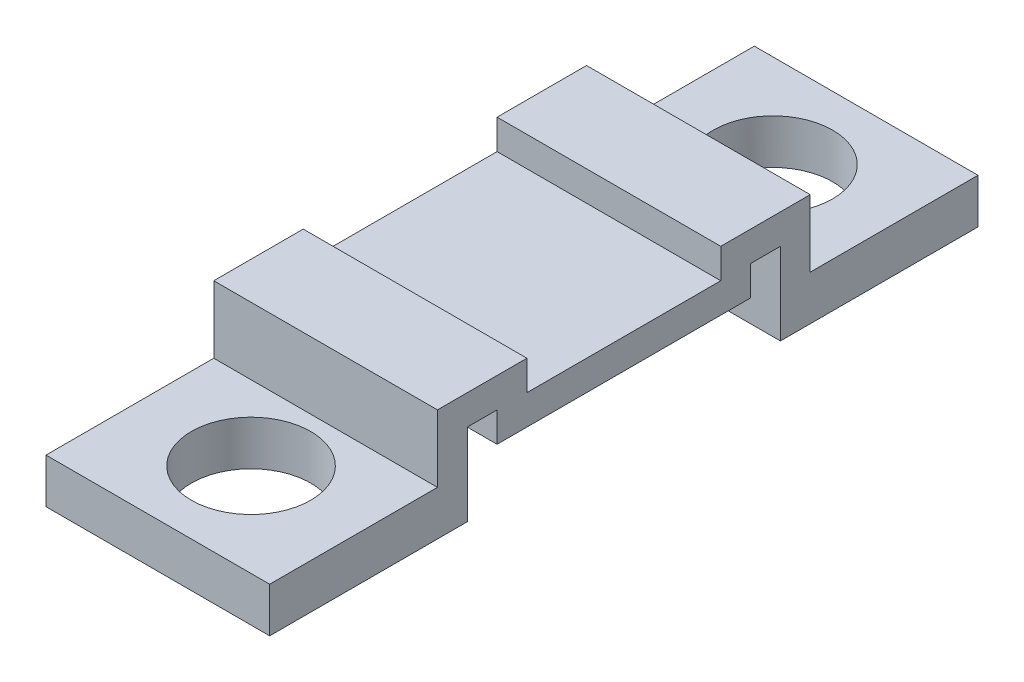
ISO-10303-21;
HEADER;
FILE_DESCRIPTION(('STEP AP214'),'2;1');
FILE_NAME('part.step','',(''),(''),'','','');
FILE_SCHEMA(('AUTOMOTIVE_DESIGN { 1 0 10303 214 1 1 1 1 }'));
ENDSEC;
DATA;
#1=APPLICATION_CONTEXT('core data for automotive mechanical design processes');
#2=APPLICATION_PROTOCOL_DEFINITION('international standard','automotive_design',2000,#1);
#3=PRODUCT_CONTEXT('',#1,'mechanical');
#4=PRODUCT('Part','Part','',(#3));
#5=PRODUCT_RELATED_PRODUCT_CATEGORY('part','',(#4));
#6=PRODUCT_DEFINITION_FORMATION('','',#4);
#7=PRODUCT_DEFINITION_CONTEXT('part definition',#1,'design');
#8=PRODUCT_DEFINITION('design','',#6,#7);
#9=PRODUCT_DEFINITION_SHAPE('','',#8);
#10=(LENGTH_UNIT() NAMED_UNIT(*) SI_UNIT(.MILLI.,.METRE.));
#11=(NAMED_UNIT(*) PLANE_ANGLE_UNIT() SI_UNIT($,.RADIAN.));
#12=(NAMED_UNIT(*) SI_UNIT($,.STERADIAN.) SOLID_ANGLE_UNIT());
#13=UNCERTAINTY_MEASURE_WITH_UNIT(LENGTH_MEASURE(1.E-05),#10,'distance_accuracy_value','');
#14=(GEOMETRIC_REPRESENTATION_CONTEXT(3) GLOBAL_UNCERTAINTY_ASSIGNED_CONTEXT((#13)) GLOBAL_UNIT_ASSIGNED_CONTEXT((#10,
#11,#12)) REPRESENTATION_CONTEXT('',''));
#15=CARTESIAN_POINT('',(0.,0.,0.));
#16=DIRECTION('',(0.,0.,1.));
#17=DIRECTION('',(1.,0.,0.));
#18=AXIS2_PLACEMENT_3D('',#15,#16,#17);
#19=CARTESIAN_POINT('',(3.,-1.,9.5));
#20=DIRECTION('',(0.,-1.,0.));
#21=DIRECTION('',(0.,0.,-1.));
#22=AXIS2_PLACEMENT_3D('',#19,#20,#21);
#23=PLANE('',#22);
#24=CARTESIAN_POINT('',(0.,-1.,7.));
#25=DIRECTION('',(0.,1.,0.));
#26=DIRECTION('',(0.,0.,1.));
#27=AXIS2_PLACEMENT_3D('',#24,#25,#26);
#28=CIRCLE('',#27,1.6);
#29=CARTESIAN_POINT('',(0.,-1.,8.6));
#30=VERTEX_POINT('',#29);
#31=EDGE_CURVE('E368',#30,#30,#28,.T.);
#32=ORIENTED_EDGE('',*,*,#31,.F.);
#33=EDGE_LOOP('',(#32));
#34=FACE_BOUND('',#33,.T.);
#35=DIRECTION('',(0.,0.,1.));
#36=VECTOR('',#35,1.);
#37=CARTESIAN_POINT('',(-3.,-1.,9.5));
#38=LINE('',#37,#36);
#39=CARTESIAN_POINT('',(-3.,-1.,5.));
#40=VERTEX_POINT('',#39);
#41=CARTESIAN_POINT('',(-3.,-1.,9.5));
#42=VERTEX_POINT('',#41);
#43=EDGE_CURVE('E204',#40,#42,#38,.T.);
#44=ORIENTED_EDGE('',*,*,#43,.T.);
#45=DIRECTION('',(-1.,0.,0.));
#46=VECTOR('',#45,1.);
#47=CARTESIAN_POINT('',(3.,-1.,9.5));
#48=LINE('',#47,#46);
#49=CARTESIAN_POINT('',(3.,-1.,9.5));
#50=VERTEX_POINT('',#49);
#51=EDGE_CURVE('E11',#50,#42,#48,.T.);
#52=ORIENTED_EDGE('',*,*,#51,.F.);
#53=DIRECTION('',(0.,0.,1.));
#54=VECTOR('',#53,1.);
#55=CARTESIAN_POINT('',(3.,-1.,9.5));
#56=LINE('',#55,#54);
#57=CARTESIAN_POINT('',(3.,-1.,5.));
#58=VERTEX_POINT('',#57);
#59=EDGE_CURVE('E243',#58,#50,#56,.T.);
#60=ORIENTED_EDGE('',*,*,#59,.F.);
#61=DIRECTION('',(-1.,0.,0.));
#62=VECTOR('',#61,1.);
#63=CARTESIAN_POINT('',(3.,-1.,5.));
#64=LINE('',#63,#62);
#65=EDGE_CURVE('E200',#58,#40,#64,.T.);
#66=ORIENTED_EDGE('',*,*,#65,.T.);
#67=EDGE_LOOP('',(#44,#52,#60,#66));
#68=FACE_BOUND('',#67,.T.);
#69=ADVANCED_FACE('F36',(#34,#68),#23,.F.);
#70=CARTESIAN_POINT('',(3.,-2.2,9.5));
#71=DIRECTION('',(0.,0.,-1.));
#72=DIRECTION('',(-1.,0.,0.));
#73=AXIS2_PLACEMENT_3D('',#70,#71,#72);
#74=PLANE('',#73);
#75=DIRECTION('',(0.,-1.,0.));
#76=VECTOR('',#75,1.);
#77=CARTESIAN_POINT('',(-3.,-2.2,9.5));
#78=LINE('',#77,#76);
#79=CARTESIAN_POINT('',(-3.,-2.2,9.5));
#80=VERTEX_POINT('',#79);
#81=EDGE_CURVE('E207',#42,#80,#78,.T.);
#82=ORIENTED_EDGE('',*,*,#81,.T.);
#83=DIRECTION('',(-1.,0.,0.));
#84=VECTOR('',#83,1.);
#85=CARTESIAN_POINT('',(3.,-2.2,9.5));
#86=LINE('',#85,#84);
#87=CARTESIAN_POINT('',(3.,-2.2,9.5));
#88=VERTEX_POINT('',#87);
#89=EDGE_CURVE('E44',#88,#80,#86,.T.);
#90=ORIENTED_EDGE('',*,*,#89,.F.);
#91=DIRECTION('',(0.,-1.,0.));
#92=VECTOR('',#91,1.);
#93=CARTESIAN_POINT('',(3.,-2.2,9.5));
#94=LINE('',#93,#92);
#95=EDGE_CURVE('E131',#50,#88,#94,.T.);
#96=ORIENTED_EDGE('',*,*,#95,.F.);
#97=ORIENTED_EDGE('',*,*,#51,.T.);
#98=EDGE_LOOP('',(#82,#90,#96,#97));
#99=FACE_BOUND('',#98,.T.);
#100=ADVANCED_FACE('F361',(#99),#74,.F.);
#101=CARTESIAN_POINT('',(3.,-2.2,4.2));
#102=DIRECTION('',(0.,1.,0.));
#103=DIRECTION('',(0.,0.,1.));
#104=AXIS2_PLACEMENT_3D('',#101,#102,#103);
#105=PLANE('',#104);
#106=CARTESIAN_POINT('',(0.,-2.2,7.));
#107=DIRECTION('',(0.,1.,0.));
#108=DIRECTION('',(0.,0.,1.));
#109=AXIS2_PLACEMENT_3D('',#106,#107,#108);
#110=CIRCLE('',#109,1.6);
#111=CARTESIAN_POINT('',(0.,-2.2,8.6));
#112=VERTEX_POINT('',#111);
#113=EDGE_CURVE('E208',#112,#112,#110,.F.);
#114=ORIENTED_EDGE('',*,*,#113,.F.);
#115=EDGE_LOOP('',(#114));
#116=FACE_BOUND('',#115,.T.);
#117=DIRECTION('',(0.,0.,-1.));
#118=VECTOR('',#117,1.);
#119=CARTESIAN_POINT('',(-3.,-2.2,4.2));
#120=LINE('',#119,#118);
#121=CARTESIAN_POINT('',(-3.,-2.2,4.2));
#122=VERTEX_POINT('',#121);
#123=EDGE_CURVE('E210',#80,#122,#120,.T.);
#124=ORIENTED_EDGE('',*,*,#123,.T.);
#125=DIRECTION('',(-1.,0.,0.));
#126=VECTOR('',#125,1.);
#127=CARTESIAN_POINT('',(3.,-2.2,4.2));
#128=LINE('',#127,#126);
#129=CARTESIAN_POINT('',(3.,-2.2,4.2));
#130=VERTEX_POINT('',#129);
#131=EDGE_CURVE('E286',#130,#122,#128,.T.);
#132=ORIENTED_EDGE('',*,*,#131,.F.);
#133=DIRECTION('',(0.,0.,-1.));
#134=VECTOR('',#133,1.);
#135=CARTESIAN_POINT('',(3.,-2.2,4.2));
#136=LINE('',#135,#134);
#137=EDGE_CURVE('E294',#88,#130,#136,.T.);
#138=ORIENTED_EDGE('',*,*,#137,.F.);
#139=ORIENTED_EDGE('',*,*,#89,.T.);
#140=EDGE_LOOP('',(#124,#132,#138,#139));
#141=FACE_BOUND('',#140,.T.);
#142=ADVANCED_FACE('F292',(#116,#141),#105,.F.);
#143=CARTESIAN_POINT('',(3.,0.,4.2));
#144=DIRECTION('',(0.,0.,1.));
#145=DIRECTION('',(1.,0.,0.));
#146=AXIS2_PLACEMENT_3D('',#143,#144,#145);
#147=PLANE('',#146);
#148=DIRECTION('',(0.,1.,0.));
#149=VECTOR('',#148,1.);
#150=CARTESIAN_POINT('',(-3.,0.,4.2));
#151=LINE('',#150,#149);
#152=CARTESIAN_POINT('',(-3.,0.,4.2));
#153=VERTEX_POINT('',#152);
#154=EDGE_CURVE('E212',#122,#153,#151,.T.);
#155=ORIENTED_EDGE('',*,*,#154,.T.);
#156=DIRECTION('',(-1.,0.,0.));
#157=VECTOR('',#156,1.);
#158=CARTESIAN_POINT('',(3.,0.,4.2));
#159=LINE('',#158,#157);
#160=CARTESIAN_POINT('',(3.,0.,4.2));
#161=VERTEX_POINT('',#160);
#162=EDGE_CURVE('E283',#161,#153,#159,.T.);
#163=ORIENTED_EDGE('',*,*,#162,.F.);
#164=DIRECTION('',(0.,1.,0.));
#165=VECTOR('',#164,1.);
#166=CARTESIAN_POINT('',(3.,0.,4.2));
#167=LINE('',#166,#165);
#168=EDGE_CURVE('E312',#130,#161,#167,.T.);
#169=ORIENTED_EDGE('',*,*,#168,.F.);
#170=ORIENTED_EDGE('',*,*,#131,.T.);
#171=EDGE_LOOP('',(#155,#163,#169,#170));
#172=FACE_BOUND('',#171,.T.);
#173=ADVANCED_FACE('F303',(#172),#147,.F.);
#174=CARTESIAN_POINT('',(3.,0.,4.2));
#175=DIRECTION('',(0.,1.,0.));
#176=DIRECTION('',(0.,0.,1.));
#177=AXIS2_PLACEMENT_3D('',#174,#175,#176);
#178=PLANE('',#177);
#179=DIRECTION('',(0.,0.,-1.));
#180=VECTOR('',#179,1.);
#181=CARTESIAN_POINT('',(-3.,0.,4.2));
#182=LINE('',#181,#180);
#183=CARTESIAN_POINT('',(-3.,0.,3.4));
#184=VERTEX_POINT('',#183);
#185=EDGE_CURVE('E214',#153,#184,#182,.T.);
#186=ORIENTED_EDGE('',*,*,#185,.T.);
#187=DIRECTION('',(-1.,0.,0.));
#188=VECTOR('',#187,1.);
#189=CARTESIAN_POINT('',(3.,0.,3.4));
#190=LINE('',#189,#188);
#191=CARTESIAN_POINT('',(3.,0.,3.4));
#192=VERTEX_POINT('',#191);
#193=EDGE_CURVE('E280',#192,#184,#190,.T.);
#194=ORIENTED_EDGE('',*,*,#193,.F.);
#195=DIRECTION('',(0.,0.,-1.));
#196=VECTOR('',#195,1.);
#197=CARTESIAN_POINT('',(3.,0.,4.2));
#198=LINE('',#197,#196);
#199=EDGE_CURVE('E309',#161,#192,#198,.T.);
#200=ORIENTED_EDGE('',*,*,#199,.F.);
#201=ORIENTED_EDGE('',*,*,#162,.T.);
#202=EDGE_LOOP('',(#186,#194,#200,#201));
#203=FACE_BOUND('',#202,.T.);
#204=ADVANCED_FACE('F307',(#203),#178,.F.);
#205=CARTESIAN_POINT('',(3.,0.,3.4));
#206=DIRECTION('',(0.,0.,-1.));
#207=DIRECTION('',(-1.,0.,0.));
#208=AXIS2_PLACEMENT_3D('',#205,#206,#207);
#209=PLANE('',#208);
#210=DIRECTION('',(0.,-1.,0.));
#211=VECTOR('',#210,1.);
#212=CARTESIAN_POINT('',(-3.,0.,3.4));
#213=LINE('',#212,#211);
#214=CARTESIAN_POINT('',(-3.,-0.799999999999999,3.4));
#215=VERTEX_POINT('',#214);
#216=EDGE_CURVE('E216',#184,#215,#213,.T.);
#217=ORIENTED_EDGE('',*,*,#216,.T.);
#218=DIRECTION('',(-1.,0.,0.));
#219=VECTOR('',#218,1.);
#220=CARTESIAN_POINT('',(3.,-0.799999999999999,3.4));
#221=LINE('',#220,#219);
#222=CARTESIAN_POINT('',(3.,-0.799999999999999,3.4));
#223=VERTEX_POINT('',#222);
#224=EDGE_CURVE('E277',#223,#215,#221,.T.);
#225=ORIENTED_EDGE('',*,*,#224,.F.);
#226=DIRECTION('',(0.,-1.,0.));
#227=VECTOR('',#226,1.);
#228=CARTESIAN_POINT('',(3.,0.,3.4));
#229=LINE('',#228,#227);
#230=EDGE_CURVE('E311',#192,#223,#229,.T.);
#231=ORIENTED_EDGE('',*,*,#230,.F.);
#232=ORIENTED_EDGE('',*,*,#193,.T.);
#233=EDGE_LOOP('',(#217,#225,#231,#232));
#234=FACE_BOUND('',#233,.T.);
#235=ADVANCED_FACE('F430',(#234),#209,.F.);
#236=CARTESIAN_POINT('',(3.,-0.799999999999999,3.4));
#237=DIRECTION('',(0.,1.,0.));
#238=DIRECTION('',(0.,0.,1.));
#239=AXIS2_PLACEMENT_3D('',#236,#237,#238);
#240=PLANE('',#239);
#241=DIRECTION('',(0.,0.,-1.));
#242=VECTOR('',#241,1.);
#243=CARTESIAN_POINT('',(-3.,-0.799999999999999,3.4));
#244=LINE('',#243,#242);
#245=CARTESIAN_POINT('',(-3.,-0.799999999999999,-3.4));
#246=VERTEX_POINT('',#245);
#247=EDGE_CURVE('E218',#215,#246,#244,.T.);
#248=ORIENTED_EDGE('',*,*,#247,.T.);
#249=DIRECTION('',(-1.,0.,0.));
#250=VECTOR('',#249,1.);
#251=CARTESIAN_POINT('',(3.,-0.799999999999999,-3.4));
#252=LINE('',#251,#250);
#253=CARTESIAN_POINT('',(3.,-0.799999999999999,-3.4));
#254=VERTEX_POINT('',#253);
#255=EDGE_CURVE('E274',#254,#246,#252,.T.);
#256=ORIENTED_EDGE('',*,*,#255,.F.);
#257=DIRECTION('',(0.,0.,-1.));
#258=VECTOR('',#257,1.);
#259=CARTESIAN_POINT('',(3.,-0.799999999999999,3.4));
#260=LINE('',#259,#258);
#261=EDGE_CURVE('E314',#223,#254,#260,.T.);
#262=ORIENTED_EDGE('',*,*,#261,.F.);
#263=ORIENTED_EDGE('',*,*,#224,.T.);
#264=EDGE_LOOP('',(#248,#256,#262,#263));
#265=FACE_BOUND('',#264,.T.);
#266=ADVANCED_FACE('F427',(#265),#240,.F.);
#267=CARTESIAN_POINT('',(3.,0.,-3.4));
#268=DIRECTION('',(0.,0.,1.));
#269=DIRECTION('',(1.,0.,0.));
#270=AXIS2_PLACEMENT_3D('',#267,#268,#269);
#271=PLANE('',#270);
#272=DIRECTION('',(0.,1.,0.));
#273=VECTOR('',#272,1.);
#274=CARTESIAN_POINT('',(-3.,0.,-3.4));
#275=LINE('',#274,#273);
#276=CARTESIAN_POINT('',(-3.,0.,-3.4));
#277=VERTEX_POINT('',#276);
#278=EDGE_CURVE('E220',#246,#277,#275,.T.);
#279=ORIENTED_EDGE('',*,*,#278,.T.);
#280=DIRECTION('',(-1.,0.,0.));
#281=VECTOR('',#280,1.);
#282=CARTESIAN_POINT('',(3.,0.,-3.4));
#283=LINE('',#282,#281);
#284=CARTESIAN_POINT('',(3.,0.,-3.4));
#285=VERTEX_POINT('',#284);
#286=EDGE_CURVE('E271',#285,#277,#283,.T.);
#287=ORIENTED_EDGE('',*,*,#286,.F.);
#288=DIRECTION('',(0.,1.,0.));
#289=VECTOR('',#288,1.);
#290=CARTESIAN_POINT('',(3.,0.,-3.4));
#291=LINE('',#290,#289);
#292=EDGE_CURVE('E320',#254,#285,#291,.T.);
#293=ORIENTED_EDGE('',*,*,#292,.F.);
#294=ORIENTED_EDGE('',*,*,#255,.T.);
#295=EDGE_LOOP('',(#279,#287,#293,#294));
#296=FACE_BOUND('',#295,.T.);
#297=ADVANCED_FACE('F423',(#296),#271,.F.);
#298=CARTESIAN_POINT('',(3.,0.,-4.2));
#299=DIRECTION('',(0.,1.,0.));
#300=DIRECTION('',(0.,0.,1.));
#301=AXIS2_PLACEMENT_3D('',#298,#299,#300);
#302=PLANE('',#301);
#303=DIRECTION('',(0.,0.,-1.));
#304=VECTOR('',#303,1.);
#305=CARTESIAN_POINT('',(-3.,0.,-4.2));
#306=LINE('',#305,#304);
#307=CARTESIAN_POINT('',(-3.,0.,-4.2));
#308=VERTEX_POINT('',#307);
#309=EDGE_CURVE('E222',#277,#308,#306,.T.);
#310=ORIENTED_EDGE('',*,*,#309,.T.);
#311=DIRECTION('',(-1.,0.,0.));
#312=VECTOR('',#311,1.);
#313=CARTESIAN_POINT('',(3.,0.,-4.2));
#314=LINE('',#313,#312);
#315=CARTESIAN_POINT('',(3.,0.,-4.2));
#316=VERTEX_POINT('',#315);
#317=EDGE_CURVE('E268',#316,#308,#314,.T.);
#318=ORIENTED_EDGE('',*,*,#317,.F.);
#319=DIRECTION('',(0.,0.,-1.));
#320=VECTOR('',#319,1.);
#321=CARTESIAN_POINT('',(3.,0.,-4.2));
#322=LINE('',#321,#320);
#323=EDGE_CURVE('E322',#285,#316,#322,.T.);
#324=ORIENTED_EDGE('',*,*,#323,.F.);
#325=ORIENTED_EDGE('',*,*,#286,.T.);
#326=EDGE_LOOP('',(#310,#318,#324,#325));
#327=FACE_BOUND('',#326,.T.);
#328=ADVANCED_FACE('F419',(#327),#302,.F.);
#329=CARTESIAN_POINT('',(3.,0.,-4.2));
#330=DIRECTION('',(0.,0.,-1.));
#331=DIRECTION('',(-1.,0.,0.));
#332=AXIS2_PLACEMENT_3D('',#329,#330,#331);
#333=PLANE('',#332);
#334=DIRECTION('',(0.,-1.,0.));
#335=VECTOR('',#334,1.);
#336=CARTESIAN_POINT('',(-3.,0.,-4.2));
#337=LINE('',#336,#335);
#338=CARTESIAN_POINT('',(-3.,-2.2,-4.2));
#339=VERTEX_POINT('',#338);
#340=EDGE_CURVE('E224',#308,#339,#337,.T.);
#341=ORIENTED_EDGE('',*,*,#340,.T.);
#342=DIRECTION('',(-1.,0.,0.));
#343=VECTOR('',#342,1.);
#344=CARTESIAN_POINT('',(3.,-2.2,-4.2));
#345=LINE('',#344,#343);
#346=CARTESIAN_POINT('',(3.,-2.2,-4.2));
#347=VERTEX_POINT('',#346);
#348=EDGE_CURVE('E265',#347,#339,#345,.T.);
#349=ORIENTED_EDGE('',*,*,#348,.F.);
#350=DIRECTION('',(0.,-1.,0.));
#351=VECTOR('',#350,1.);
#352=CARTESIAN_POINT('',(3.,0.,-4.2));
#353=LINE('',#352,#351);
#354=EDGE_CURVE('E324',#316,#347,#353,.T.);
#355=ORIENTED_EDGE('',*,*,#354,.F.);
#356=ORIENTED_EDGE('',*,*,#317,.T.);
#357=EDGE_LOOP('',(#341,#349,#355,#356));
#358=FACE_BOUND('',#357,.T.);
#359=ADVANCED_FACE('F389',(#358),#333,.F.);
#360=CARTESIAN_POINT('',(3.,-2.2,-4.2));
#361=DIRECTION('',(0.,1.,0.));
#362=DIRECTION('',(0.,0.,1.));
#363=AXIS2_PLACEMENT_3D('',#360,#361,#362);
#364=PLANE('',#363);
#365=CARTESIAN_POINT('',(0.,-2.2,-7.));
#366=DIRECTION('',(0.,1.,0.));
#367=DIRECTION('',(0.,0.,1.));
#368=AXIS2_PLACEMENT_3D('',#365,#366,#367);
#369=CIRCLE('',#368,1.6);
#370=CARTESIAN_POINT('',(0.,-2.2,-5.4));
#371=VERTEX_POINT('',#370);
#372=EDGE_CURVE('E375',#371,#371,#369,.F.);
#373=ORIENTED_EDGE('',*,*,#372,.F.);
#374=EDGE_LOOP('',(#373));
#375=FACE_BOUND('',#374,.T.);
#376=DIRECTION('',(0.,0.,-1.));
#377=VECTOR('',#376,1.);
#378=CARTESIAN_POINT('',(-3.,-2.2,-4.2));
#379=LINE('',#378,#377);
#380=CARTESIAN_POINT('',(-3.,-2.2,-9.5));
#381=VERTEX_POINT('',#380);
#382=EDGE_CURVE('E226',#339,#381,#379,.T.);
#383=ORIENTED_EDGE('',*,*,#382,.T.);
#384=DIRECTION('',(-1.,0.,0.));
#385=VECTOR('',#384,1.);
#386=CARTESIAN_POINT('',(3.,-2.2,-9.5));
#387=LINE('',#386,#385);
#388=CARTESIAN_POINT('',(3.,-2.2,-9.5));
#389=VERTEX_POINT('',#388);
#390=EDGE_CURVE('E262',#389,#381,#387,.T.);
#391=ORIENTED_EDGE('',*,*,#390,.F.);
#392=DIRECTION('',(0.,0.,-1.));
#393=VECTOR('',#392,1.);
#394=CARTESIAN_POINT('',(3.,-2.2,-4.2));
#395=LINE('',#394,#393);
#396=EDGE_CURVE('E326',#347,#389,#395,.T.);
#397=ORIENTED_EDGE('',*,*,#396,.F.);
#398=ORIENTED_EDGE('',*,*,#348,.T.);
#399=EDGE_LOOP('',(#383,#391,#397,#398));
#400=FACE_BOUND('',#399,.T.);
#401=ADVANCED_FACE('F385',(#375,#400),#364,.F.);
#402=CARTESIAN_POINT('',(3.,-2.2,-9.5));
#403=DIRECTION('',(0.,0.,1.));
#404=DIRECTION('',(1.,0.,0.));
#405=AXIS2_PLACEMENT_3D('',#402,#403,#404);
#406=PLANE('',#405);
#407=DIRECTION('',(0.,1.,0.));
#408=VECTOR('',#407,1.);
#409=CARTESIAN_POINT('',(-3.,-2.2,-9.5));
#410=LINE('',#409,#408);
#411=CARTESIAN_POINT('',(-3.,-1.,-9.5));
#412=VERTEX_POINT('',#411);
#413=EDGE_CURVE('E228',#381,#412,#410,.T.);
#414=ORIENTED_EDGE('',*,*,#413,.T.);
#415=DIRECTION('',(-1.,0.,0.));
#416=VECTOR('',#415,1.);
#417=CARTESIAN_POINT('',(3.,-1.,-9.5));
#418=LINE('',#417,#416);
#419=CARTESIAN_POINT('',(3.,-1.,-9.5));
#420=VERTEX_POINT('',#419);
#421=EDGE_CURVE('E259',#420,#412,#418,.T.);
#422=ORIENTED_EDGE('',*,*,#421,.F.);
#423=DIRECTION('',(0.,1.,0.));
#424=VECTOR('',#423,1.);
#425=CARTESIAN_POINT('',(3.,-2.2,-9.5));
#426=LINE('',#425,#424);
#427=EDGE_CURVE('E328',#389,#420,#426,.T.);
#428=ORIENTED_EDGE('',*,*,#427,.F.);
#429=ORIENTED_EDGE('',*,*,#390,.T.);
#430=EDGE_LOOP('',(#414,#422,#428,#429));
#431=FACE_BOUND('',#430,.T.);
#432=ADVANCED_FACE('F388',(#431),#406,.F.);
#433=CARTESIAN_POINT('',(3.,-1.,-9.5));
#434=DIRECTION('',(0.,-1.,0.));
#435=DIRECTION('',(0.,0.,-1.));
#436=AXIS2_PLACEMENT_3D('',#433,#434,#435);
#437=PLANE('',#436);
#438=CARTESIAN_POINT('',(0.,-1.,-7.));
#439=DIRECTION('',(0.,1.,0.));
#440=DIRECTION('',(0.,0.,-1.));
#441=AXIS2_PLACEMENT_3D('',#438,#439,#440);
#442=CIRCLE('',#441,1.6);
#443=CARTESIAN_POINT('',(0.,-1.,-8.6));
#444=VERTEX_POINT('',#443);
#445=EDGE_CURVE('E370',#444,#444,#442,.T.);
#446=ORIENTED_EDGE('',*,*,#445,.F.);
#447=EDGE_LOOP('',(#446));
#448=FACE_BOUND('',#447,.T.);
#449=DIRECTION('',(0.,0.,1.));
#450=VECTOR('',#449,1.);
#451=CARTESIAN_POINT('',(-3.,-1.,-9.5));
#452=LINE('',#451,#450);
#453=CARTESIAN_POINT('',(-3.,-1.,-5.));
#454=VERTEX_POINT('',#453);
#455=EDGE_CURVE('E230',#412,#454,#452,.T.);
#456=ORIENTED_EDGE('',*,*,#455,.T.);
#457=DIRECTION('',(-1.,0.,0.));
#458=VECTOR('',#457,1.);
#459=CARTESIAN_POINT('',(3.,-1.,-5.));
#460=LINE('',#459,#458);
#461=CARTESIAN_POINT('',(3.,-1.,-5.));
#462=VERTEX_POINT('',#461);
#463=EDGE_CURVE('E256',#462,#454,#460,.T.);
#464=ORIENTED_EDGE('',*,*,#463,.F.);
#465=DIRECTION('',(0.,0.,1.));
#466=VECTOR('',#465,1.);
#467=CARTESIAN_POINT('',(3.,-1.,-9.5));
#468=LINE('',#467,#466);
#469=EDGE_CURVE('E330',#420,#462,#468,.T.);
#470=ORIENTED_EDGE('',*,*,#469,.F.);
#471=ORIENTED_EDGE('',*,*,#421,.T.);
#472=EDGE_LOOP('',(#456,#464,#470,#471));
#473=FACE_BOUND('',#472,.T.);
#474=ADVANCED_FACE('F405',(#448,#473),#437,.F.);
#475=CARTESIAN_POINT('',(3.,-1.,-5.));
#476=DIRECTION('',(0.,0.,1.));
#477=DIRECTION('',(1.,0.,0.));
#478=AXIS2_PLACEMENT_3D('',#475,#476,#477);
#479=PLANE('',#478);
#480=DIRECTION('',(0.,1.,0.));
#481=VECTOR('',#480,1.);
#482=CARTESIAN_POINT('',(-3.,-1.,-5.));
#483=LINE('',#482,#481);
#484=CARTESIAN_POINT('',(-3.,0.8,-5.));
#485=VERTEX_POINT('',#484);
#486=EDGE_CURVE('E232',#454,#485,#483,.T.);
#487=ORIENTED_EDGE('',*,*,#486,.T.);
#488=DIRECTION('',(-1.,0.,0.));
#489=VECTOR('',#488,1.);
#490=CARTESIAN_POINT('',(3.,0.8,-5.));
#491=LINE('',#490,#489);
#492=CARTESIAN_POINT('',(3.,0.8,-5.));
#493=VERTEX_POINT('',#492);
#494=EDGE_CURVE('E253',#493,#485,#491,.T.);
#495=ORIENTED_EDGE('',*,*,#494,.F.);
#496=DIRECTION('',(0.,1.,0.));
#497=VECTOR('',#496,1.);
#498=CARTESIAN_POINT('',(3.,-1.,-5.));
#499=LINE('',#498,#497);
#500=EDGE_CURVE('E332',#462,#493,#499,.T.);
#501=ORIENTED_EDGE('',*,*,#500,.F.);
#502=ORIENTED_EDGE('',*,*,#463,.T.);
#503=EDGE_LOOP('',(#487,#495,#501,#502));
#504=FACE_BOUND('',#503,.T.);
#505=ADVANCED_FACE('F409',(#504),#479,.F.);
#506=CARTESIAN_POINT('',(3.,0.8,-5.));
#507=DIRECTION('',(0.,-1.,0.));
#508=DIRECTION('',(0.,0.,-1.));
#509=AXIS2_PLACEMENT_3D('',#506,#507,#508);
#510=PLANE('',#509);
#511=DIRECTION('',(0.,0.,1.));
#512=VECTOR('',#511,1.);
#513=CARTESIAN_POINT('',(-3.,0.8,-5.));
#514=LINE('',#513,#512);
#515=CARTESIAN_POINT('',(-3.,0.8,-2.6));
#516=VERTEX_POINT('',#515);
#517=EDGE_CURVE('E234',#485,#516,#514,.T.);
#518=ORIENTED_EDGE('',*,*,#517,.T.);
#519=DIRECTION('',(-1.,0.,0.));
#520=VECTOR('',#519,1.);
#521=CARTESIAN_POINT('',(3.,0.8,-2.6));
#522=LINE('',#521,#520);
#523=CARTESIAN_POINT('',(3.,0.8,-2.6));
#524=VERTEX_POINT('',#523);
#525=EDGE_CURVE('E250',#524,#516,#522,.T.);
#526=ORIENTED_EDGE('',*,*,#525,.F.);
#527=DIRECTION('',(0.,0.,1.));
#528=VECTOR('',#527,1.);
#529=CARTESIAN_POINT('',(3.,0.8,-5.));
#530=LINE('',#529,#528);
#531=EDGE_CURVE('E334',#493,#524,#530,.T.);
#532=ORIENTED_EDGE('',*,*,#531,.F.);
#533=ORIENTED_EDGE('',*,*,#494,.T.);
#534=EDGE_LOOP('',(#518,#526,#532,#533));
#535=FACE_BOUND('',#534,.T.);
#536=ADVANCED_FACE('F524',(#535),#510,.F.);
#537=CARTESIAN_POINT('',(3.,0.8,-2.6));
#538=DIRECTION('',(0.,0.,-1.));
#539=DIRECTION('',(-1.,0.,0.));
#540=AXIS2_PLACEMENT_3D('',#537,#538,#539);
#541=PLANE('',#540);
#542=DIRECTION('',(0.,-1.,0.));
#543=VECTOR('',#542,1.);
#544=CARTESIAN_POINT('',(-3.,0.8,-2.6));
#545=LINE('',#544,#543);
#546=CARTESIAN_POINT('',(-3.,0.,-2.6));
#547=VERTEX_POINT('',#546);
#548=EDGE_CURVE('E236',#516,#547,#545,.T.);
#549=ORIENTED_EDGE('',*,*,#548,.T.);
#550=DIRECTION('',(-1.,0.,0.));
#551=VECTOR('',#550,1.);
#552=CARTESIAN_POINT('',(3.,0.,-2.6));
#553=LINE('',#552,#551);
#554=CARTESIAN_POINT('',(3.,0.,-2.6));
#555=VERTEX_POINT('',#554);
#556=EDGE_CURVE('E247',#555,#547,#553,.T.);
#557=ORIENTED_EDGE('',*,*,#556,.F.);
#558=DIRECTION('',(0.,-1.,0.));
#559=VECTOR('',#558,1.);
#560=CARTESIAN_POINT('',(3.,0.8,-2.6));
#561=LINE('',#560,#559);
#562=EDGE_CURVE('E336',#524,#555,#561,.T.);
#563=ORIENTED_EDGE('',*,*,#562,.F.);
#564=ORIENTED_EDGE('',*,*,#525,.T.);
#565=EDGE_LOOP('',(#549,#557,#563,#564));
#566=FACE_BOUND('',#565,.T.);
#567=ADVANCED_FACE('F342',(#566),#541,.F.);
#568=CARTESIAN_POINT('',(3.,0.,2.6));
#569=DIRECTION('',(0.,-1.,0.));
#570=DIRECTION('',(0.,0.,-1.));
#571=AXIS2_PLACEMENT_3D('',#568,#569,#570);
#572=PLANE('',#571);
#573=DIRECTION('',(0.,0.,1.));
#574=VECTOR('',#573,1.);
#575=CARTESIAN_POINT('',(-3.,0.,2.6));
#576=LINE('',#575,#574);
#577=CARTESIAN_POINT('',(-3.,0.,2.6));
#578=VERTEX_POINT('',#577);
#579=EDGE_CURVE('E238',#547,#578,#576,.T.);
#580=ORIENTED_EDGE('',*,*,#579,.T.);
#581=DIRECTION('',(-1.,0.,0.));
#582=VECTOR('',#581,1.);
#583=CARTESIAN_POINT('',(3.,0.,2.6));
#584=LINE('',#583,#582);
#585=CARTESIAN_POINT('',(3.,0.,2.6));
#586=VERTEX_POINT('',#585);
#587=EDGE_CURVE('E195',#586,#578,#584,.T.);
#588=ORIENTED_EDGE('',*,*,#587,.F.);
#589=DIRECTION('',(0.,0.,1.));
#590=VECTOR('',#589,1.);
#591=CARTESIAN_POINT('',(3.,0.,2.6));
#592=LINE('',#591,#590);
#593=EDGE_CURVE('E186',#555,#586,#592,.T.);
#594=ORIENTED_EDGE('',*,*,#593,.F.);
#595=ORIENTED_EDGE('',*,*,#556,.T.);
#596=EDGE_LOOP('',(#580,#588,#594,#595));
#597=FACE_BOUND('',#596,.T.);
#598=ADVANCED_FACE('F346',(#597),#572,.F.);
#599=CARTESIAN_POINT('',(3.,0.8,2.6));
#600=DIRECTION('',(0.,0.,1.));
#601=DIRECTION('',(1.,0.,0.));
#602=AXIS2_PLACEMENT_3D('',#599,#600,#601);
#603=PLANE('',#602);
#604=DIRECTION('',(0.,1.,0.));
#605=VECTOR('',#604,1.);
#606=CARTESIAN_POINT('',(-3.,0.8,2.6));
#607=LINE('',#606,#605);
#608=CARTESIAN_POINT('',(-3.,0.8,2.6));
#609=VERTEX_POINT('',#608);
#610=EDGE_CURVE('E194',#578,#609,#607,.T.);
#611=ORIENTED_EDGE('',*,*,#610,.T.);
#612=DIRECTION('',(-1.,0.,0.));
#613=VECTOR('',#612,1.);
#614=CARTESIAN_POINT('',(3.,0.8,2.6));
#615=LINE('',#614,#613);
#616=CARTESIAN_POINT('',(3.,0.8,2.6));
#617=VERTEX_POINT('',#616);
#618=EDGE_CURVE('E191',#617,#609,#615,.T.);
#619=ORIENTED_EDGE('',*,*,#618,.F.);
#620=DIRECTION('',(0.,1.,0.));
#621=VECTOR('',#620,1.);
#622=CARTESIAN_POINT('',(3.,0.8,2.6));
#623=LINE('',#622,#621);
#624=EDGE_CURVE('E180',#586,#617,#623,.T.);
#625=ORIENTED_EDGE('',*,*,#624,.F.);
#626=ORIENTED_EDGE('',*,*,#587,.T.);
#627=EDGE_LOOP('',(#611,#619,#625,#626));
#628=FACE_BOUND('',#627,.T.);
#629=ADVANCED_FACE('F192',(#628),#603,.F.);
#630=CARTESIAN_POINT('',(3.,0.8,5.));
#631=DIRECTION('',(0.,-1.,0.));
#632=DIRECTION('',(0.,0.,-1.));
#633=AXIS2_PLACEMENT_3D('',#630,#631,#632);
#634=PLANE('',#633);
#635=DIRECTION('',(0.,0.,1.));
#636=VECTOR('',#635,1.);
#637=CARTESIAN_POINT('',(-3.,0.8,5.));
#638=LINE('',#637,#636);
#639=CARTESIAN_POINT('',(-3.,0.8,5.));
#640=VERTEX_POINT('',#639);
#641=EDGE_CURVE('E117',#609,#640,#638,.T.);
#642=ORIENTED_EDGE('',*,*,#641,.T.);
#643=DIRECTION('',(-1.,0.,0.));
#644=VECTOR('',#643,1.);
#645=CARTESIAN_POINT('',(3.,0.8,5.));
#646=LINE('',#645,#644);
#647=CARTESIAN_POINT('',(3.,0.8,5.));
#648=VERTEX_POINT('',#647);
#649=EDGE_CURVE('E196',#648,#640,#646,.T.);
#650=ORIENTED_EDGE('',*,*,#649,.F.);
#651=DIRECTION('',(0.,0.,1.));
#652=VECTOR('',#651,1.);
#653=CARTESIAN_POINT('',(3.,0.8,5.));
#654=LINE('',#653,#652);
#655=EDGE_CURVE('E184',#617,#648,#654,.T.);
#656=ORIENTED_EDGE('',*,*,#655,.F.);
#657=ORIENTED_EDGE('',*,*,#618,.T.);
#658=EDGE_LOOP('',(#642,#650,#656,#657));
#659=FACE_BOUND('',#658,.T.);
#660=ADVANCED_FACE('F198',(#659),#634,.F.);
#661=CARTESIAN_POINT('',(3.,-1.,5.));
#662=DIRECTION('',(0.,0.,-1.));
#663=DIRECTION('',(-1.,0.,0.));
#664=AXIS2_PLACEMENT_3D('',#661,#662,#663);
#665=PLANE('',#664);
#666=DIRECTION('',(0.,-1.,0.));
#667=VECTOR('',#666,1.);
#668=CARTESIAN_POINT('',(-3.,-1.,5.));
#669=LINE('',#668,#667);
#670=EDGE_CURVE('E123',#640,#40,#669,.T.);
#671=ORIENTED_EDGE('',*,*,#670,.T.);
#672=ORIENTED_EDGE('',*,*,#65,.F.);
#673=DIRECTION('',(0.,-1.,0.));
#674=VECTOR('',#673,1.);
#675=CARTESIAN_POINT('',(3.,-1.,5.));
#676=LINE('',#675,#674);
#677=EDGE_CURVE('E52',#648,#58,#676,.T.);
#678=ORIENTED_EDGE('',*,*,#677,.F.);
#679=ORIENTED_EDGE('',*,*,#649,.T.);
#680=EDGE_LOOP('',(#671,#672,#678,#679));
#681=FACE_BOUND('',#680,.T.);
#682=ADVANCED_FACE('F350',(#681),#665,.F.);
#683=CARTESIAN_POINT('',(3.,0.,0.));
#684=DIRECTION('',(1.,0.,0.));
#685=DIRECTION('',(0.,0.,-1.));
#686=AXIS2_PLACEMENT_3D('',#683,#684,#685);
#687=PLANE('',#686);
#688=ORIENTED_EDGE('',*,*,#59,.T.);
#689=ORIENTED_EDGE('',*,*,#95,.T.);
#690=ORIENTED_EDGE('',*,*,#137,.T.);
#691=ORIENTED_EDGE('',*,*,#168,.T.);
#692=ORIENTED_EDGE('',*,*,#199,.T.);
#693=ORIENTED_EDGE('',*,*,#230,.T.);
#694=ORIENTED_EDGE('',*,*,#261,.T.);
#695=ORIENTED_EDGE('',*,*,#292,.T.);
#696=ORIENTED_EDGE('',*,*,#323,.T.);
#697=ORIENTED_EDGE('',*,*,#354,.T.);
#698=ORIENTED_EDGE('',*,*,#396,.T.);
#699=ORIENTED_EDGE('',*,*,#427,.T.);
#700=ORIENTED_EDGE('',*,*,#469,.T.);
#701=ORIENTED_EDGE('',*,*,#500,.T.);
#702=ORIENTED_EDGE('',*,*,#531,.T.);
#703=ORIENTED_EDGE('',*,*,#562,.T.);
#704=ORIENTED_EDGE('',*,*,#593,.T.);
#705=ORIENTED_EDGE('',*,*,#624,.T.);
#706=ORIENTED_EDGE('',*,*,#655,.T.);
#707=ORIENTED_EDGE('',*,*,#677,.T.);
#708=EDGE_LOOP('',(#688,#689,#690,#691,#692,#693,#694,#695,#696,#697,#698,#699,#700,#701,#702,
#703,#704,#705,#706,#707));
#709=FACE_BOUND('',#708,.T.);
#710=ADVANCED_FACE('F182',(#709),#687,.T.);
#711=CARTESIAN_POINT('',(-3.,0.,0.));
#712=DIRECTION('',(1.,0.,0.));
#713=DIRECTION('',(0.,0.,-1.));
#714=AXIS2_PLACEMENT_3D('',#711,#712,#713);
#715=PLANE('',#714);
#716=ORIENTED_EDGE('',*,*,#43,.F.);
#717=ORIENTED_EDGE('',*,*,#670,.F.);
#718=ORIENTED_EDGE('',*,*,#641,.F.);
#719=ORIENTED_EDGE('',*,*,#610,.F.);
#720=ORIENTED_EDGE('',*,*,#579,.F.);
#721=ORIENTED_EDGE('',*,*,#548,.F.);
#722=ORIENTED_EDGE('',*,*,#517,.F.);
#723=ORIENTED_EDGE('',*,*,#486,.F.);
#724=ORIENTED_EDGE('',*,*,#455,.F.);
#725=ORIENTED_EDGE('',*,*,#413,.F.);
#726=ORIENTED_EDGE('',*,*,#382,.F.);
#727=ORIENTED_EDGE('',*,*,#340,.F.);
#728=ORIENTED_EDGE('',*,*,#309,.F.);
#729=ORIENTED_EDGE('',*,*,#278,.F.);
#730=ORIENTED_EDGE('',*,*,#247,.F.);
#731=ORIENTED_EDGE('',*,*,#216,.F.);
#732=ORIENTED_EDGE('',*,*,#185,.F.);
#733=ORIENTED_EDGE('',*,*,#154,.F.);
#734=ORIENTED_EDGE('',*,*,#123,.F.);
#735=ORIENTED_EDGE('',*,*,#81,.F.);
#736=EDGE_LOOP('',(#716,#717,#718,#719,#720,#721,#722,#723,#724,#725,#726,#727,#728,#729,#730,
#731,#732,#733,#734,#735));
#737=FACE_BOUND('',#736,.T.);
#738=ADVANCED_FACE('F298',(#737),#715,.F.);
#739=CARTESIAN_POINT('',(0.,-2.201,-7.));
#740=DIRECTION('',(0.,1.,0.));
#741=DIRECTION('',(0.,0.,1.));
#742=AXIS2_PLACEMENT_3D('',#739,#740,#741);
#743=CYLINDRICAL_SURFACE('',#742,1.6);
#744=ORIENTED_EDGE('',*,*,#445,.T.);
#745=EDGE_LOOP('',(#744));
#746=FACE_BOUND('',#745,.T.);
#747=ORIENTED_EDGE('',*,*,#372,.T.);
#748=EDGE_LOOP('',(#747));
#749=FACE_BOUND('',#748,.T.);
#750=ADVANCED_FACE('F383',(#746,#749),#743,.F.);
#751=CARTESIAN_POINT('',(0.,-2.201,7.));
#752=DIRECTION('',(0.,1.,0.));
#753=DIRECTION('',(0.,0.,1.));
#754=AXIS2_PLACEMENT_3D('',#751,#752,#753);
#755=CYLINDRICAL_SURFACE('',#754,1.6);
#756=ORIENTED_EDGE('',*,*,#31,.T.);
#757=EDGE_LOOP('',(#756));
#758=FACE_BOUND('',#757,.T.);
#759=ORIENTED_EDGE('',*,*,#113,.T.);
#760=EDGE_LOOP('',(#759));
#761=FACE_BOUND('',#760,.T.);
#762=ADVANCED_FACE('F449',(#758,#761),#755,.F.);
#763=CLOSED_SHELL('',(#69,#100,#142,#173,#204,#235,#266,#297,#328,#359,#401,#432,#474,#505,#536,
#567,#598,#629,#660,#682,#710,#738,#750,#762));
#764=MANIFOLD_SOLID_BREP('B2',#763);
#765=ADVANCED_BREP_SHAPE_REPRESENTATION('',(#18,#764),#14);
#766=SHAPE_DEFINITION_REPRESENTATION(#9,#765);
ENDSEC;
END-ISO-10303-21;
